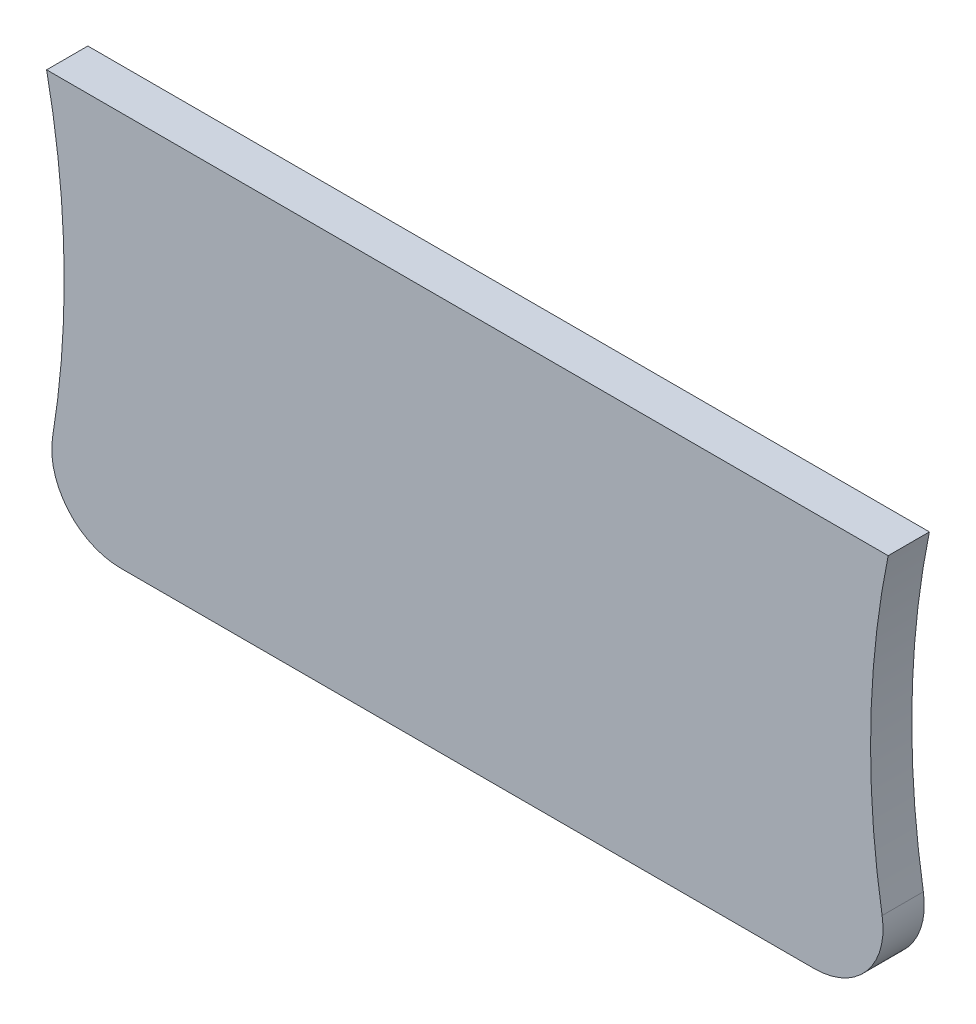
ISO-10303-21;
HEADER;
FILE_DESCRIPTION(('STEP AP214'),'2;1');
FILE_NAME('part.step','',(''),(''),'','','');
FILE_SCHEMA(('AUTOMOTIVE_DESIGN { 1 0 10303 214 1 1 1 1 }'));
ENDSEC;
DATA;
#1=APPLICATION_CONTEXT('core data for automotive mechanical design processes');
#2=APPLICATION_PROTOCOL_DEFINITION('international standard','automotive_design',2000,#1);
#3=PRODUCT_CONTEXT('',#1,'mechanical');
#4=PRODUCT('Part','Part','',(#3));
#5=PRODUCT_RELATED_PRODUCT_CATEGORY('part','',(#4));
#6=PRODUCT_DEFINITION_FORMATION('','',#4);
#7=PRODUCT_DEFINITION_CONTEXT('part definition',#1,'design');
#8=PRODUCT_DEFINITION('design','',#6,#7);
#9=PRODUCT_DEFINITION_SHAPE('','',#8);
#10=(LENGTH_UNIT() NAMED_UNIT(*) SI_UNIT(.MILLI.,.METRE.));
#11=(NAMED_UNIT(*) PLANE_ANGLE_UNIT() SI_UNIT($,.RADIAN.));
#12=(NAMED_UNIT(*) SI_UNIT($,.STERADIAN.) SOLID_ANGLE_UNIT());
#13=UNCERTAINTY_MEASURE_WITH_UNIT(LENGTH_MEASURE(1.E-05),#10,'distance_accuracy_value','');
#14=(GEOMETRIC_REPRESENTATION_CONTEXT(3) GLOBAL_UNCERTAINTY_ASSIGNED_CONTEXT((#13)) GLOBAL_UNIT_ASSIGNED_CONTEXT((#10,
#11,#12)) REPRESENTATION_CONTEXT('',''));
#15=CARTESIAN_POINT('',(0.,0.,0.));
#16=DIRECTION('',(0.,0.,1.));
#17=DIRECTION('',(1.,0.,0.));
#18=AXIS2_PLACEMENT_3D('',#15,#16,#17);
#19=CARTESIAN_POINT('',(-46.0101267806729,-55.881642548565,3.));
#20=DIRECTION('',(0.,0.,-1.));
#21=DIRECTION('',(-1.,0.,0.));
#22=AXIS2_PLACEMENT_3D('',#19,#20,#21);
#23=CYLINDRICAL_SURFACE('',#22,5.);
#24=CARTESIAN_POINT('',(-46.0101267806729,-55.881642548565,0.));
#25=DIRECTION('',(0.,0.,1.));
#26=DIRECTION('',(1.,0.,0.));
#27=AXIS2_PLACEMENT_3D('',#24,#25,#26);
#28=CIRCLE('',#27,5.);
#29=CARTESIAN_POINT('',(-46.0101267806729,-60.881642548565,0.));
#30=VERTEX_POINT('',#29);
#31=CARTESIAN_POINT('',(-41.0768923491989,-55.0672728265593,0.));
#32=VERTEX_POINT('',#31);
#33=EDGE_CURVE('E123',#30,#32,#28,.T.);
#34=ORIENTED_EDGE('',*,*,#33,.T.);
#35=DIRECTION('',(0.,0.,-1.));
#36=VECTOR('',#35,1.);
#37=CARTESIAN_POINT('',(-41.0768923491989,-55.0672728265593,3.));
#38=LINE('',#37,#36);
#39=CARTESIAN_POINT('',(-41.0768923491989,-55.0672728265593,3.));
#40=VERTEX_POINT('',#39);
#41=EDGE_CURVE('E11',#40,#32,#38,.T.);
#42=ORIENTED_EDGE('',*,*,#41,.F.);
#43=CARTESIAN_POINT('',(-46.0101267806729,-55.881642548565,3.));
#44=DIRECTION('',(0.,0.,1.));
#45=DIRECTION('',(1.,0.,0.));
#46=AXIS2_PLACEMENT_3D('',#43,#44,#45);
#47=CIRCLE('',#46,5.);
#48=CARTESIAN_POINT('',(-46.0101267806729,-60.881642548565,3.));
#49=VERTEX_POINT('',#48);
#50=EDGE_CURVE('E133',#49,#40,#47,.T.);
#51=ORIENTED_EDGE('',*,*,#50,.F.);
#52=DIRECTION('',(0.,0.,-1.));
#53=VECTOR('',#52,1.);
#54=CARTESIAN_POINT('',(-46.0101267806729,-60.881642548565,3.));
#55=LINE('',#54,#53);
#56=EDGE_CURVE('E119',#49,#30,#55,.T.);
#57=ORIENTED_EDGE('',*,*,#56,.T.);
#58=EDGE_LOOP('',(#34,#42,#51,#57));
#59=FACE_BOUND('',#58,.T.);
#60=ADVANCED_FACE('F39',(#59),#23,.T.);
#61=CARTESIAN_POINT('',(21.0818614873733,-44.8062143292883,3.));
#62=DIRECTION('',(0.,0.,-1.));
#63=DIRECTION('',(-1.,0.,0.));
#64=AXIS2_PLACEMENT_3D('',#61,#62,#63);
#65=CYLINDRICAL_SURFACE('',#64,63.);
#66=CARTESIAN_POINT('',(21.0818614873733,-44.8062143292883,0.));
#67=DIRECTION('',(0.,0.,-1.));
#68=DIRECTION('',(1.,0.,0.));
#69=AXIS2_PLACEMENT_3D('',#66,#67,#68);
#70=CIRCLE('',#69,63.);
#71=CARTESIAN_POINT('',(-40.6374616792293,-32.1679728433667,0.));
#72=VERTEX_POINT('',#71);
#73=EDGE_CURVE('E126',#32,#72,#70,.T.);
#74=ORIENTED_EDGE('',*,*,#73,.T.);
#75=DIRECTION('',(0.,0.,-1.));
#76=VECTOR('',#75,1.);
#77=CARTESIAN_POINT('',(-40.6374616792293,-32.1679728433667,3.));
#78=LINE('',#77,#76);
#79=CARTESIAN_POINT('',(-40.6374616792293,-32.1679728433667,3.));
#80=VERTEX_POINT('',#79);
#81=EDGE_CURVE('E47',#80,#72,#78,.T.);
#82=ORIENTED_EDGE('',*,*,#81,.F.);
#83=CARTESIAN_POINT('',(21.0818614873733,-44.8062143292883,3.));
#84=DIRECTION('',(0.,0.,-1.));
#85=DIRECTION('',(1.,0.,0.));
#86=AXIS2_PLACEMENT_3D('',#83,#84,#85);
#87=CIRCLE('',#86,63.);
#88=EDGE_CURVE('E92',#40,#80,#87,.T.);
#89=ORIENTED_EDGE('',*,*,#88,.F.);
#90=ORIENTED_EDGE('',*,*,#41,.T.);
#91=EDGE_LOOP('',(#74,#82,#89,#90));
#92=FACE_BOUND('',#91,.T.);
#93=ADVANCED_FACE('F157',(#92),#65,.F.);
#94=CARTESIAN_POINT('',(-101.876241757273,-32.1679728433667,3.));
#95=DIRECTION('',(0.,-1.,0.));
#96=DIRECTION('',(1.,0.,0.));
#97=AXIS2_PLACEMENT_3D('',#94,#95,#96);
#98=PLANE('',#97);
#99=DIRECTION('',(-1.,0.,0.));
#100=VECTOR('',#99,1.);
#101=CARTESIAN_POINT('',(-101.876241757273,-32.1679728433667,0.));
#102=LINE('',#101,#100);
#103=CARTESIAN_POINT('',(-101.876241757273,-32.1679728433667,0.));
#104=VERTEX_POINT('',#103);
#105=EDGE_CURVE('E128',#72,#104,#102,.T.);
#106=ORIENTED_EDGE('',*,*,#105,.T.);
#107=DIRECTION('',(0.,0.,-1.));
#108=VECTOR('',#107,1.);
#109=CARTESIAN_POINT('',(-101.876241757273,-32.1679728433667,3.));
#110=LINE('',#109,#108);
#111=CARTESIAN_POINT('',(-101.876241757273,-32.1679728433667,3.));
#112=VERTEX_POINT('',#111);
#113=EDGE_CURVE('E114',#112,#104,#110,.T.);
#114=ORIENTED_EDGE('',*,*,#113,.F.);
#115=DIRECTION('',(-1.,0.,0.));
#116=VECTOR('',#115,1.);
#117=CARTESIAN_POINT('',(-101.876241757273,-32.1679728433667,3.));
#118=LINE('',#117,#116);
#119=EDGE_CURVE('E105',#80,#112,#118,.T.);
#120=ORIENTED_EDGE('',*,*,#119,.F.);
#121=ORIENTED_EDGE('',*,*,#81,.T.);
#122=EDGE_LOOP('',(#106,#114,#120,#121));
#123=FACE_BOUND('',#122,.T.);
#124=ADVANCED_FACE('F139',(#123),#98,.F.);
#125=CARTESIAN_POINT('',(-163.595564923876,-44.8062143292883,3.));
#126=DIRECTION('',(0.,0.,-1.));
#127=DIRECTION('',(-1.,0.,0.));
#128=AXIS2_PLACEMENT_3D('',#125,#126,#127);
#129=CYLINDRICAL_SURFACE('',#128,63.);
#130=CARTESIAN_POINT('',(-163.595564923876,-44.8062143292883,0.));
#131=DIRECTION('',(0.,0.,-1.));
#132=DIRECTION('',(1.,0.,0.));
#133=AXIS2_PLACEMENT_3D('',#130,#131,#132);
#134=CIRCLE('',#133,63.);
#135=CARTESIAN_POINT('',(-101.436811087304,-55.0672728265594,0.));
#136=VERTEX_POINT('',#135);
#137=EDGE_CURVE('E113',#104,#136,#134,.T.);
#138=ORIENTED_EDGE('',*,*,#137,.T.);
#139=DIRECTION('',(0.,0.,-1.));
#140=VECTOR('',#139,1.);
#141=CARTESIAN_POINT('',(-101.436811087304,-55.0672728265594,3.));
#142=LINE('',#141,#140);
#143=CARTESIAN_POINT('',(-101.436811087304,-55.0672728265594,3.));
#144=VERTEX_POINT('',#143);
#145=EDGE_CURVE('E110',#144,#136,#142,.T.);
#146=ORIENTED_EDGE('',*,*,#145,.F.);
#147=CARTESIAN_POINT('',(-163.595564923876,-44.8062143292883,3.));
#148=DIRECTION('',(0.,0.,-1.));
#149=DIRECTION('',(1.,0.,0.));
#150=AXIS2_PLACEMENT_3D('',#147,#148,#149);
#151=CIRCLE('',#150,63.);
#152=EDGE_CURVE('E99',#112,#144,#151,.T.);
#153=ORIENTED_EDGE('',*,*,#152,.F.);
#154=ORIENTED_EDGE('',*,*,#113,.T.);
#155=EDGE_LOOP('',(#138,#146,#153,#154));
#156=FACE_BOUND('',#155,.T.);
#157=ADVANCED_FACE('F111',(#156),#129,.F.);
#158=CARTESIAN_POINT('',(-96.5035766558297,-55.881642548565,3.));
#159=DIRECTION('',(0.,0.,-1.));
#160=DIRECTION('',(-1.,0.,0.));
#161=AXIS2_PLACEMENT_3D('',#158,#159,#160);
#162=CYLINDRICAL_SURFACE('',#161,4.99999999999999);
#163=CARTESIAN_POINT('',(-96.5035766558297,-55.881642548565,0.));
#164=DIRECTION('',(0.,0.,1.));
#165=DIRECTION('',(1.,0.,0.));
#166=AXIS2_PLACEMENT_3D('',#163,#164,#165);
#167=CIRCLE('',#166,4.99999999999999);
#168=CARTESIAN_POINT('',(-96.5035766558297,-60.881642548565,0.));
#169=VERTEX_POINT('',#168);
#170=EDGE_CURVE('E78',#136,#169,#167,.T.);
#171=ORIENTED_EDGE('',*,*,#170,.T.);
#172=DIRECTION('',(0.,0.,-1.));
#173=VECTOR('',#172,1.);
#174=CARTESIAN_POINT('',(-96.5035766558297,-60.881642548565,3.));
#175=LINE('',#174,#173);
#176=CARTESIAN_POINT('',(-96.5035766558297,-60.881642548565,3.));
#177=VERTEX_POINT('',#176);
#178=EDGE_CURVE('E115',#177,#169,#175,.T.);
#179=ORIENTED_EDGE('',*,*,#178,.F.);
#180=CARTESIAN_POINT('',(-96.5035766558297,-55.881642548565,3.));
#181=DIRECTION('',(0.,0.,1.));
#182=DIRECTION('',(1.,0.,0.));
#183=AXIS2_PLACEMENT_3D('',#180,#181,#182);
#184=CIRCLE('',#183,4.99999999999999);
#185=EDGE_CURVE('E103',#144,#177,#184,.T.);
#186=ORIENTED_EDGE('',*,*,#185,.F.);
#187=ORIENTED_EDGE('',*,*,#145,.T.);
#188=EDGE_LOOP('',(#171,#179,#186,#187));
#189=FACE_BOUND('',#188,.T.);
#190=ADVANCED_FACE('F117',(#189),#162,.T.);
#191=CARTESIAN_POINT('',(-96.5035766558297,-60.881642548565,3.));
#192=DIRECTION('',(0.,1.,0.));
#193=DIRECTION('',(0.,0.,1.));
#194=AXIS2_PLACEMENT_3D('',#191,#192,#193);
#195=PLANE('',#194);
#196=DIRECTION('',(1.,0.,0.));
#197=VECTOR('',#196,1.);
#198=CARTESIAN_POINT('',(-96.5035766558297,-60.881642548565,0.));
#199=LINE('',#198,#197);
#200=EDGE_CURVE('E84',#169,#30,#199,.T.);
#201=ORIENTED_EDGE('',*,*,#200,.T.);
#202=ORIENTED_EDGE('',*,*,#56,.F.);
#203=DIRECTION('',(1.,0.,0.));
#204=VECTOR('',#203,1.);
#205=CARTESIAN_POINT('',(-96.5035766558297,-60.881642548565,3.));
#206=LINE('',#205,#204);
#207=EDGE_CURVE('E55',#177,#49,#206,.T.);
#208=ORIENTED_EDGE('',*,*,#207,.F.);
#209=ORIENTED_EDGE('',*,*,#178,.T.);
#210=EDGE_LOOP('',(#201,#202,#208,#209));
#211=FACE_BOUND('',#210,.T.);
#212=ADVANCED_FACE('F146',(#211),#195,.F.);
#213=CARTESIAN_POINT('',(-46.0101267806729,-55.881642548565,3.));
#214=DIRECTION('',(0.,0.,1.));
#215=DIRECTION('',(1.,0.,0.));
#216=AXIS2_PLACEMENT_3D('',#213,#214,#215);
#217=PLANE('',#216);
#218=ORIENTED_EDGE('',*,*,#50,.T.);
#219=ORIENTED_EDGE('',*,*,#88,.T.);
#220=ORIENTED_EDGE('',*,*,#119,.T.);
#221=ORIENTED_EDGE('',*,*,#152,.T.);
#222=ORIENTED_EDGE('',*,*,#185,.T.);
#223=ORIENTED_EDGE('',*,*,#207,.T.);
#224=EDGE_LOOP('',(#218,#219,#220,#221,#222,#223));
#225=FACE_BOUND('',#224,.T.);
#226=ADVANCED_FACE('F101',(#225),#217,.T.);
#227=CARTESIAN_POINT('',(-46.0101267806729,-55.881642548565,0.));
#228=DIRECTION('',(0.,0.,1.));
#229=DIRECTION('',(1.,0.,0.));
#230=AXIS2_PLACEMENT_3D('',#227,#228,#229);
#231=PLANE('',#230);
#232=ORIENTED_EDGE('',*,*,#33,.F.);
#233=ORIENTED_EDGE('',*,*,#200,.F.);
#234=ORIENTED_EDGE('',*,*,#170,.F.);
#235=ORIENTED_EDGE('',*,*,#137,.F.);
#236=ORIENTED_EDGE('',*,*,#105,.F.);
#237=ORIENTED_EDGE('',*,*,#73,.F.);
#238=EDGE_LOOP('',(#232,#233,#234,#235,#236,#237));
#239=FACE_BOUND('',#238,.T.);
#240=ADVANCED_FACE('F142',(#239),#231,.F.);
#241=CLOSED_SHELL('',(#60,#93,#124,#157,#190,#212,#226,#240));
#242=MANIFOLD_SOLID_BREP('B2',#241);
#243=ADVANCED_BREP_SHAPE_REPRESENTATION('',(#18,#242),#14);
#244=SHAPE_DEFINITION_REPRESENTATION(#9,#243);
ENDSEC;
END-ISO-10303-21;
